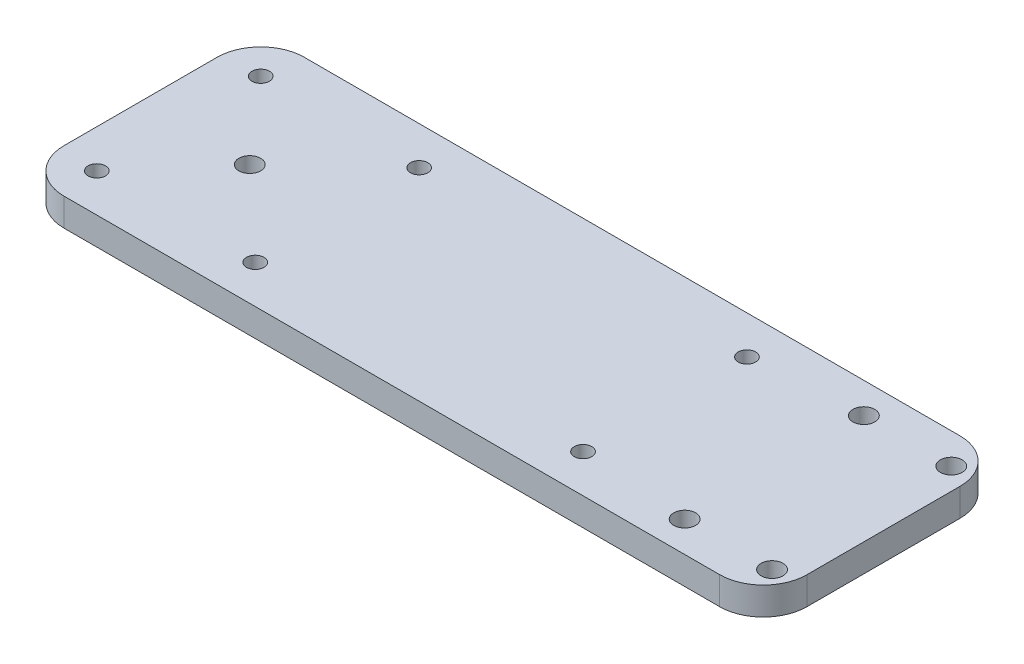
ISO-10303-21;
HEADER;
FILE_DESCRIPTION(('STEP AP214'),'2;1');
FILE_NAME('part.step','',(''),(''),'','','');
FILE_SCHEMA(('AUTOMOTIVE_DESIGN { 1 0 10303 214 1 1 1 1 }'));
ENDSEC;
DATA;
#1=APPLICATION_CONTEXT('core data for automotive mechanical design processes');
#2=APPLICATION_PROTOCOL_DEFINITION('international standard','automotive_design',2000,#1);
#3=PRODUCT_CONTEXT('',#1,'mechanical');
#4=PRODUCT('Part','Part','',(#3));
#5=PRODUCT_RELATED_PRODUCT_CATEGORY('part','',(#4));
#6=PRODUCT_DEFINITION_FORMATION('','',#4);
#7=PRODUCT_DEFINITION_CONTEXT('part definition',#1,'design');
#8=PRODUCT_DEFINITION('design','',#6,#7);
#9=PRODUCT_DEFINITION_SHAPE('','',#8);
#10=(LENGTH_UNIT() NAMED_UNIT(*) SI_UNIT(.MILLI.,.METRE.));
#11=(NAMED_UNIT(*) PLANE_ANGLE_UNIT() SI_UNIT($,.RADIAN.));
#12=(NAMED_UNIT(*) SI_UNIT($,.STERADIAN.) SOLID_ANGLE_UNIT());
#13=UNCERTAINTY_MEASURE_WITH_UNIT(LENGTH_MEASURE(1.E-05),#10,'distance_accuracy_value','');
#14=(GEOMETRIC_REPRESENTATION_CONTEXT(3) GLOBAL_UNCERTAINTY_ASSIGNED_CONTEXT((#13)) GLOBAL_UNIT_ASSIGNED_CONTEXT((#10,
#11,#12)) REPRESENTATION_CONTEXT('',''));
#15=CARTESIAN_POINT('',(0.,0.,0.));
#16=DIRECTION('',(0.,0.,1.));
#17=DIRECTION('',(1.,0.,0.));
#18=AXIS2_PLACEMENT_3D('',#15,#16,#17);
#19=CARTESIAN_POINT('',(-25.,6.35,-27.5));
#20=DIRECTION('',(1.,0.,0.));
#21=DIRECTION('',(0.,0.,-1.));
#22=AXIS2_PLACEMENT_3D('',#19,#20,#21);
#23=PLANE('',#22);
#24=DIRECTION('',(0.,0.,1.));
#25=VECTOR('',#24,1.);
#26=CARTESIAN_POINT('',(-25.,0.,-27.5));
#27=LINE('',#26,#25);
#28=CARTESIAN_POINT('',(-25.,0.,-17.5));
#29=VERTEX_POINT('',#28);
#30=CARTESIAN_POINT('',(-25.,0.,17.5));
#31=VERTEX_POINT('',#30);
#32=EDGE_CURVE('E136',#29,#31,#27,.T.);
#33=ORIENTED_EDGE('',*,*,#32,.T.);
#34=DIRECTION('',(0.,-1.,0.));
#35=VECTOR('',#34,1.);
#36=CARTESIAN_POINT('',(-25.,6.35,17.5));
#37=LINE('',#36,#35);
#38=CARTESIAN_POINT('',(-25.,6.35,17.5));
#39=VERTEX_POINT('',#38);
#40=EDGE_CURVE('E111',#31,#39,#37,.F.);
#41=ORIENTED_EDGE('',*,*,#40,.T.);
#42=DIRECTION('',(0.,0.,1.));
#43=VECTOR('',#42,1.);
#44=CARTESIAN_POINT('',(-25.,6.35,-27.5));
#45=LINE('',#44,#43);
#46=CARTESIAN_POINT('',(-25.,6.35,-17.5));
#47=VERTEX_POINT('',#46);
#48=EDGE_CURVE('E149',#47,#39,#45,.T.);
#49=ORIENTED_EDGE('',*,*,#48,.F.);
#50=DIRECTION('',(0.,-1.,0.));
#51=VECTOR('',#50,1.);
#52=CARTESIAN_POINT('',(-25.,6.35,-17.5));
#53=LINE('',#52,#51);
#54=EDGE_CURVE('E117',#47,#29,#53,.T.);
#55=ORIENTED_EDGE('',*,*,#54,.T.);
#56=EDGE_LOOP('',(#33,#41,#49,#55));
#57=FACE_BOUND('',#56,.T.);
#58=ADVANCED_FACE('F39',(#57),#23,.F.);
#59=CARTESIAN_POINT('',(-25.,6.35,27.5));
#60=DIRECTION('',(0.,0.,-1.));
#61=DIRECTION('',(-1.,0.,0.));
#62=AXIS2_PLACEMENT_3D('',#59,#60,#61);
#63=PLANE('',#62);
#64=DIRECTION('',(1.,0.,0.));
#65=VECTOR('',#64,1.);
#66=CARTESIAN_POINT('',(-25.,6.35,27.5));
#67=LINE('',#66,#65);
#68=CARTESIAN_POINT('',(-15.,6.35,27.5));
#69=VERTEX_POINT('',#68);
#70=CARTESIAN_POINT('',(135.,6.35,27.5));
#71=VERTEX_POINT('',#70);
#72=EDGE_CURVE('E127',#69,#71,#67,.T.);
#73=ORIENTED_EDGE('',*,*,#72,.F.);
#74=DIRECTION('',(0.,-1.,0.));
#75=VECTOR('',#74,1.);
#76=CARTESIAN_POINT('',(-15.,6.35,27.5));
#77=LINE('',#76,#75);
#78=CARTESIAN_POINT('',(-15.,0.,27.5));
#79=VERTEX_POINT('',#78);
#80=EDGE_CURVE('E110',#69,#79,#77,.T.);
#81=ORIENTED_EDGE('',*,*,#80,.T.);
#82=DIRECTION('',(1.,0.,0.));
#83=VECTOR('',#82,1.);
#84=CARTESIAN_POINT('',(-25.,0.,27.5));
#85=LINE('',#84,#83);
#86=CARTESIAN_POINT('',(135.,0.,27.5));
#87=VERTEX_POINT('',#86);
#88=EDGE_CURVE('E124',#79,#87,#85,.T.);
#89=ORIENTED_EDGE('',*,*,#88,.T.);
#90=DIRECTION('',(0.,-1.,0.));
#91=VECTOR('',#90,1.);
#92=CARTESIAN_POINT('',(135.,6.35,27.5));
#93=LINE('',#92,#91);
#94=EDGE_CURVE('E130',#87,#71,#93,.F.);
#95=ORIENTED_EDGE('',*,*,#94,.T.);
#96=EDGE_LOOP('',(#73,#81,#89,#95));
#97=FACE_BOUND('',#96,.T.);
#98=ADVANCED_FACE('F123',(#97),#63,.F.);
#99=CARTESIAN_POINT('',(145.,6.35,-27.5));
#100=DIRECTION('',(-1.,0.,0.));
#101=DIRECTION('',(0.,0.,1.));
#102=AXIS2_PLACEMENT_3D('',#99,#100,#101);
#103=PLANE('',#102);
#104=DIRECTION('',(0.,0.,-1.));
#105=VECTOR('',#104,1.);
#106=CARTESIAN_POINT('',(145.,0.,-27.5));
#107=LINE('',#106,#105);
#108=CARTESIAN_POINT('',(145.,0.,17.5));
#109=VERTEX_POINT('',#108);
#110=CARTESIAN_POINT('',(145.,0.,-17.5));
#111=VERTEX_POINT('',#110);
#112=EDGE_CURVE('E135',#109,#111,#107,.T.);
#113=ORIENTED_EDGE('',*,*,#112,.T.);
#114=DIRECTION('',(0.,-1.,0.));
#115=VECTOR('',#114,1.);
#116=CARTESIAN_POINT('',(145.,6.35,-17.5));
#117=LINE('',#116,#115);
#118=CARTESIAN_POINT('',(145.,6.35,-17.5));
#119=VERTEX_POINT('',#118);
#120=EDGE_CURVE('E11',#111,#119,#117,.F.);
#121=ORIENTED_EDGE('',*,*,#120,.T.);
#122=DIRECTION('',(0.,0.,-1.));
#123=VECTOR('',#122,1.);
#124=CARTESIAN_POINT('',(145.,6.35,-27.5));
#125=LINE('',#124,#123);
#126=CARTESIAN_POINT('',(145.,6.35,17.5));
#127=VERTEX_POINT('',#126);
#128=EDGE_CURVE('E188',#127,#119,#125,.T.);
#129=ORIENTED_EDGE('',*,*,#128,.F.);
#130=DIRECTION('',(0.,-1.,0.));
#131=VECTOR('',#130,1.);
#132=CARTESIAN_POINT('',(145.,6.35,17.5));
#133=LINE('',#132,#131);
#134=EDGE_CURVE('E48',#127,#109,#133,.T.);
#135=ORIENTED_EDGE('',*,*,#134,.T.);
#136=EDGE_LOOP('',(#113,#121,#129,#135));
#137=FACE_BOUND('',#136,.T.);
#138=ADVANCED_FACE('F186',(#137),#103,.F.);
#139=CARTESIAN_POINT('',(-25.,6.35,-27.5));
#140=DIRECTION('',(0.,0.,1.));
#141=DIRECTION('',(1.,0.,0.));
#142=AXIS2_PLACEMENT_3D('',#139,#140,#141);
#143=PLANE('',#142);
#144=DIRECTION('',(-1.,0.,0.));
#145=VECTOR('',#144,1.);
#146=CARTESIAN_POINT('',(-25.,0.,-27.5));
#147=LINE('',#146,#145);
#148=CARTESIAN_POINT('',(135.,0.,-27.5));
#149=VERTEX_POINT('',#148);
#150=CARTESIAN_POINT('',(-15.,0.,-27.5));
#151=VERTEX_POINT('',#150);
#152=EDGE_CURVE('E141',#149,#151,#147,.T.);
#153=ORIENTED_EDGE('',*,*,#152,.T.);
#154=DIRECTION('',(0.,-1.,0.));
#155=VECTOR('',#154,1.);
#156=CARTESIAN_POINT('',(-15.,6.35,-27.5));
#157=LINE('',#156,#155);
#158=CARTESIAN_POINT('',(-15.,6.35,-27.5));
#159=VERTEX_POINT('',#158);
#160=EDGE_CURVE('E55',#151,#159,#157,.F.);
#161=ORIENTED_EDGE('',*,*,#160,.T.);
#162=DIRECTION('',(-1.,0.,0.));
#163=VECTOR('',#162,1.);
#164=CARTESIAN_POINT('',(-25.,6.35,-27.5));
#165=LINE('',#164,#163);
#166=CARTESIAN_POINT('',(135.,6.35,-27.5));
#167=VERTEX_POINT('',#166);
#168=EDGE_CURVE('E151',#167,#159,#165,.T.);
#169=ORIENTED_EDGE('',*,*,#168,.F.);
#170=DIRECTION('',(0.,-1.,0.));
#171=VECTOR('',#170,1.);
#172=CARTESIAN_POINT('',(135.,6.35,-27.5));
#173=LINE('',#172,#171);
#174=EDGE_CURVE('E176',#167,#149,#173,.T.);
#175=ORIENTED_EDGE('',*,*,#174,.T.);
#176=EDGE_LOOP('',(#153,#161,#169,#175));
#177=FACE_BOUND('',#176,.T.);
#178=ADVANCED_FACE('F195',(#177),#143,.F.);
#179=CARTESIAN_POINT('',(0.,6.35,0.));
#180=DIRECTION('',(0.,1.,0.));
#181=DIRECTION('',(0.,0.,1.));
#182=AXIS2_PLACEMENT_3D('',#179,#180,#181);
#183=PLANE('',#182);
#184=CARTESIAN_POINT('',(140.,6.35,-20.5));
#185=DIRECTION('',(0.,1.,0.));
#186=DIRECTION('',(0.,0.,1.));
#187=AXIS2_PLACEMENT_3D('',#184,#185,#186);
#188=CIRCLE('',#187,2.5);
#189=CARTESIAN_POINT('',(140.,6.35,-18.));
#190=VERTEX_POINT('',#189);
#191=EDGE_CURVE('E289',#190,#190,#188,.T.);
#192=ORIENTED_EDGE('',*,*,#191,.F.);
#193=EDGE_LOOP('',(#192));
#194=FACE_BOUND('',#193,.T.);
#195=CARTESIAN_POINT('',(120.,6.35,-20.5));
#196=DIRECTION('',(0.,1.,0.));
#197=DIRECTION('',(0.,0.,1.));
#198=AXIS2_PLACEMENT_3D('',#195,#196,#197);
#199=CIRCLE('',#198,2.49999999999999);
#200=CARTESIAN_POINT('',(120.,6.35,-18.));
#201=VERTEX_POINT('',#200);
#202=EDGE_CURVE('E281',#201,#201,#199,.T.);
#203=ORIENTED_EDGE('',*,*,#202,.F.);
#204=EDGE_LOOP('',(#203));
#205=FACE_BOUND('',#204,.T.);
#206=CARTESIAN_POINT('',(140.,6.35,20.5));
#207=DIRECTION('',(0.,1.,0.));
#208=DIRECTION('',(0.,0.,1.));
#209=AXIS2_PLACEMENT_3D('',#206,#207,#208);
#210=CIRCLE('',#209,2.5);
#211=CARTESIAN_POINT('',(140.,6.35,23.));
#212=VERTEX_POINT('',#211);
#213=EDGE_CURVE('E273',#212,#212,#210,.T.);
#214=ORIENTED_EDGE('',*,*,#213,.F.);
#215=EDGE_LOOP('',(#214));
#216=FACE_BOUND('',#215,.T.);
#217=CARTESIAN_POINT('',(120.,6.35,20.5));
#218=DIRECTION('',(0.,1.,0.));
#219=DIRECTION('',(0.,0.,1.));
#220=AXIS2_PLACEMENT_3D('',#217,#218,#219);
#221=CIRCLE('',#220,2.49999999999999);
#222=CARTESIAN_POINT('',(120.,6.35,23.));
#223=VERTEX_POINT('',#222);
#224=EDGE_CURVE('E265',#223,#223,#221,.T.);
#225=ORIENTED_EDGE('',*,*,#224,.F.);
#226=EDGE_LOOP('',(#225));
#227=FACE_BOUND('',#226,.T.);
#228=CARTESIAN_POINT('',(-16.25,6.35,18.75));
#229=DIRECTION('',(0.,1.,0.));
#230=DIRECTION('',(0.,0.,1.));
#231=AXIS2_PLACEMENT_3D('',#228,#229,#230);
#232=CIRCLE('',#231,2.);
#233=CARTESIAN_POINT('',(-16.25,6.35,20.75));
#234=VERTEX_POINT('',#233);
#235=EDGE_CURVE('E257',#234,#234,#232,.T.);
#236=ORIENTED_EDGE('',*,*,#235,.F.);
#237=EDGE_LOOP('',(#236));
#238=FACE_BOUND('',#237,.T.);
#239=CARTESIAN_POINT('',(20.,6.35,18.75));
#240=DIRECTION('',(0.,1.,0.));
#241=DIRECTION('',(0.,0.,1.));
#242=AXIS2_PLACEMENT_3D('',#239,#240,#241);
#243=CIRCLE('',#242,2.);
#244=CARTESIAN_POINT('',(20.,6.35,20.75));
#245=VERTEX_POINT('',#244);
#246=EDGE_CURVE('E249',#245,#245,#243,.T.);
#247=ORIENTED_EDGE('',*,*,#246,.F.);
#248=EDGE_LOOP('',(#247));
#249=FACE_BOUND('',#248,.T.);
#250=CARTESIAN_POINT('',(95.,6.35,18.75));
#251=DIRECTION('',(0.,1.,0.));
#252=DIRECTION('',(0.,0.,1.));
#253=AXIS2_PLACEMENT_3D('',#250,#251,#252);
#254=CIRCLE('',#253,2.);
#255=CARTESIAN_POINT('',(95.,6.35,20.75));
#256=VERTEX_POINT('',#255);
#257=EDGE_CURVE('E241',#256,#256,#254,.T.);
#258=ORIENTED_EDGE('',*,*,#257,.F.);
#259=EDGE_LOOP('',(#258));
#260=FACE_BOUND('',#259,.T.);
#261=CARTESIAN_POINT('',(95.,6.35,-18.75));
#262=DIRECTION('',(0.,1.,0.));
#263=DIRECTION('',(0.,0.,1.));
#264=AXIS2_PLACEMENT_3D('',#261,#262,#263);
#265=CIRCLE('',#264,2.);
#266=CARTESIAN_POINT('',(95.,6.35,-16.75));
#267=VERTEX_POINT('',#266);
#268=EDGE_CURVE('E233',#267,#267,#265,.T.);
#269=ORIENTED_EDGE('',*,*,#268,.F.);
#270=EDGE_LOOP('',(#269));
#271=FACE_BOUND('',#270,.T.);
#272=CARTESIAN_POINT('',(20.,6.35,-18.75));
#273=DIRECTION('',(0.,1.,0.));
#274=DIRECTION('',(0.,0.,1.));
#275=AXIS2_PLACEMENT_3D('',#272,#273,#274);
#276=CIRCLE('',#275,2.);
#277=CARTESIAN_POINT('',(20.,6.35,-16.75));
#278=VERTEX_POINT('',#277);
#279=EDGE_CURVE('E225',#278,#278,#276,.T.);
#280=ORIENTED_EDGE('',*,*,#279,.F.);
#281=EDGE_LOOP('',(#280));
#282=FACE_BOUND('',#281,.T.);
#283=CARTESIAN_POINT('',(-16.25,6.35,-18.75));
#284=DIRECTION('',(0.,1.,0.));
#285=DIRECTION('',(0.,0.,1.));
#286=AXIS2_PLACEMENT_3D('',#283,#284,#285);
#287=CIRCLE('',#286,2.);
#288=CARTESIAN_POINT('',(-16.25,6.35,-16.75));
#289=VERTEX_POINT('',#288);
#290=EDGE_CURVE('E217',#289,#289,#287,.T.);
#291=ORIENTED_EDGE('',*,*,#290,.F.);
#292=EDGE_LOOP('',(#291));
#293=FACE_BOUND('',#292,.T.);
#294=CARTESIAN_POINT('',(0.,6.35,0.));
#295=DIRECTION('',(0.,1.,0.));
#296=DIRECTION('',(0.,0.,1.));
#297=AXIS2_PLACEMENT_3D('',#294,#295,#296);
#298=CIRCLE('',#297,2.5);
#299=CARTESIAN_POINT('',(0.,6.35,2.5));
#300=VERTEX_POINT('',#299);
#301=EDGE_CURVE('E209',#300,#300,#298,.T.);
#302=ORIENTED_EDGE('',*,*,#301,.F.);
#303=EDGE_LOOP('',(#302));
#304=FACE_BOUND('',#303,.T.);
#305=ORIENTED_EDGE('',*,*,#48,.T.);
#306=CARTESIAN_POINT('',(-15.,6.35,17.5));
#307=DIRECTION('',(0.,1.,0.));
#308=DIRECTION('',(0.,0.,1.));
#309=AXIS2_PLACEMENT_3D('',#306,#307,#308);
#310=CIRCLE('',#309,10.);
#311=EDGE_CURVE('E173',#39,#69,#310,.T.);
#312=ORIENTED_EDGE('',*,*,#311,.T.);
#313=ORIENTED_EDGE('',*,*,#72,.T.);
#314=CARTESIAN_POINT('',(135.,6.35,17.5));
#315=DIRECTION('',(0.,1.,0.));
#316=DIRECTION('',(0.,0.,1.));
#317=AXIS2_PLACEMENT_3D('',#314,#315,#316);
#318=CIRCLE('',#317,10.);
#319=EDGE_CURVE('E165',#71,#127,#318,.T.);
#320=ORIENTED_EDGE('',*,*,#319,.T.);
#321=ORIENTED_EDGE('',*,*,#128,.T.);
#322=CARTESIAN_POINT('',(135.,6.35,-17.5));
#323=DIRECTION('',(0.,1.,0.));
#324=DIRECTION('',(0.,0.,1.));
#325=AXIS2_PLACEMENT_3D('',#322,#323,#324);
#326=CIRCLE('',#325,10.);
#327=EDGE_CURVE('E62',#119,#167,#326,.T.);
#328=ORIENTED_EDGE('',*,*,#327,.T.);
#329=ORIENTED_EDGE('',*,*,#168,.T.);
#330=CARTESIAN_POINT('',(-15.,6.35,-17.5));
#331=DIRECTION('',(0.,1.,0.));
#332=DIRECTION('',(0.,0.,1.));
#333=AXIS2_PLACEMENT_3D('',#330,#331,#332);
#334=CIRCLE('',#333,10.);
#335=EDGE_CURVE('E170',#159,#47,#334,.T.);
#336=ORIENTED_EDGE('',*,*,#335,.T.);
#337=EDGE_LOOP('',(#305,#312,#313,#320,#321,#328,#329,#336));
#338=FACE_BOUND('',#337,.T.);
#339=ADVANCED_FACE('F296',(#194,#205,#216,#227,#238,#249,#260,#271,#282,#293,#304,#338),#183,.T.);
#340=CARTESIAN_POINT('',(0.,0.,0.));
#341=DIRECTION('',(0.,1.,0.));
#342=DIRECTION('',(0.,0.,1.));
#343=AXIS2_PLACEMENT_3D('',#340,#341,#342);
#344=PLANE('',#343);
#345=CARTESIAN_POINT('',(140.,0.,-20.5));
#346=DIRECTION('',(0.,1.,0.));
#347=DIRECTION('',(0.,0.,1.));
#348=AXIS2_PLACEMENT_3D('',#345,#346,#347);
#349=CIRCLE('',#348,2.5);
#350=CARTESIAN_POINT('',(140.,0.,-18.));
#351=VERTEX_POINT('',#350);
#352=EDGE_CURVE('E285',#351,#351,#349,.T.);
#353=ORIENTED_EDGE('',*,*,#352,.T.);
#354=EDGE_LOOP('',(#353));
#355=FACE_BOUND('',#354,.T.);
#356=CARTESIAN_POINT('',(120.,0.,-20.5));
#357=DIRECTION('',(0.,1.,0.));
#358=DIRECTION('',(0.,0.,1.));
#359=AXIS2_PLACEMENT_3D('',#356,#357,#358);
#360=CIRCLE('',#359,2.5);
#361=CARTESIAN_POINT('',(120.,0.,-18.));
#362=VERTEX_POINT('',#361);
#363=EDGE_CURVE('E277',#362,#362,#360,.T.);
#364=ORIENTED_EDGE('',*,*,#363,.T.);
#365=EDGE_LOOP('',(#364));
#366=FACE_BOUND('',#365,.T.);
#367=CARTESIAN_POINT('',(140.,0.,20.5));
#368=DIRECTION('',(0.,1.,0.));
#369=DIRECTION('',(0.,0.,1.));
#370=AXIS2_PLACEMENT_3D('',#367,#368,#369);
#371=CIRCLE('',#370,2.5);
#372=CARTESIAN_POINT('',(140.,0.,23.));
#373=VERTEX_POINT('',#372);
#374=EDGE_CURVE('E269',#373,#373,#371,.T.);
#375=ORIENTED_EDGE('',*,*,#374,.T.);
#376=EDGE_LOOP('',(#375));
#377=FACE_BOUND('',#376,.T.);
#378=CARTESIAN_POINT('',(120.,0.,20.5));
#379=DIRECTION('',(0.,1.,0.));
#380=DIRECTION('',(0.,0.,1.));
#381=AXIS2_PLACEMENT_3D('',#378,#379,#380);
#382=CIRCLE('',#381,2.5);
#383=CARTESIAN_POINT('',(120.,0.,23.));
#384=VERTEX_POINT('',#383);
#385=EDGE_CURVE('E261',#384,#384,#382,.T.);
#386=ORIENTED_EDGE('',*,*,#385,.T.);
#387=EDGE_LOOP('',(#386));
#388=FACE_BOUND('',#387,.T.);
#389=CARTESIAN_POINT('',(-16.25,0.,18.75));
#390=DIRECTION('',(0.,1.,0.));
#391=DIRECTION('',(0.,0.,1.));
#392=AXIS2_PLACEMENT_3D('',#389,#390,#391);
#393=CIRCLE('',#392,2.);
#394=CARTESIAN_POINT('',(-16.25,0.,20.75));
#395=VERTEX_POINT('',#394);
#396=EDGE_CURVE('E253',#395,#395,#393,.T.);
#397=ORIENTED_EDGE('',*,*,#396,.T.);
#398=EDGE_LOOP('',(#397));
#399=FACE_BOUND('',#398,.T.);
#400=CARTESIAN_POINT('',(20.,0.,18.75));
#401=DIRECTION('',(0.,1.,0.));
#402=DIRECTION('',(0.,0.,1.));
#403=AXIS2_PLACEMENT_3D('',#400,#401,#402);
#404=CIRCLE('',#403,2.);
#405=CARTESIAN_POINT('',(20.,0.,20.75));
#406=VERTEX_POINT('',#405);
#407=EDGE_CURVE('E245',#406,#406,#404,.T.);
#408=ORIENTED_EDGE('',*,*,#407,.T.);
#409=EDGE_LOOP('',(#408));
#410=FACE_BOUND('',#409,.T.);
#411=CARTESIAN_POINT('',(95.,0.,18.75));
#412=DIRECTION('',(0.,1.,0.));
#413=DIRECTION('',(0.,0.,1.));
#414=AXIS2_PLACEMENT_3D('',#411,#412,#413);
#415=CIRCLE('',#414,2.);
#416=CARTESIAN_POINT('',(95.,0.,20.75));
#417=VERTEX_POINT('',#416);
#418=EDGE_CURVE('E237',#417,#417,#415,.T.);
#419=ORIENTED_EDGE('',*,*,#418,.T.);
#420=EDGE_LOOP('',(#419));
#421=FACE_BOUND('',#420,.T.);
#422=CARTESIAN_POINT('',(95.,0.,-18.75));
#423=DIRECTION('',(0.,1.,0.));
#424=DIRECTION('',(0.,0.,1.));
#425=AXIS2_PLACEMENT_3D('',#422,#423,#424);
#426=CIRCLE('',#425,2.);
#427=CARTESIAN_POINT('',(95.,0.,-16.75));
#428=VERTEX_POINT('',#427);
#429=EDGE_CURVE('E229',#428,#428,#426,.T.);
#430=ORIENTED_EDGE('',*,*,#429,.T.);
#431=EDGE_LOOP('',(#430));
#432=FACE_BOUND('',#431,.T.);
#433=CARTESIAN_POINT('',(20.,0.,-18.75));
#434=DIRECTION('',(0.,1.,0.));
#435=DIRECTION('',(0.,0.,1.));
#436=AXIS2_PLACEMENT_3D('',#433,#434,#435);
#437=CIRCLE('',#436,2.);
#438=CARTESIAN_POINT('',(20.,0.,-16.75));
#439=VERTEX_POINT('',#438);
#440=EDGE_CURVE('E221',#439,#439,#437,.T.);
#441=ORIENTED_EDGE('',*,*,#440,.T.);
#442=EDGE_LOOP('',(#441));
#443=FACE_BOUND('',#442,.T.);
#444=CARTESIAN_POINT('',(-16.25,0.,-18.75));
#445=DIRECTION('',(0.,1.,0.));
#446=DIRECTION('',(0.,0.,1.));
#447=AXIS2_PLACEMENT_3D('',#444,#445,#446);
#448=CIRCLE('',#447,2.);
#449=CARTESIAN_POINT('',(-16.25,0.,-16.75));
#450=VERTEX_POINT('',#449);
#451=EDGE_CURVE('E213',#450,#450,#448,.T.);
#452=ORIENTED_EDGE('',*,*,#451,.T.);
#453=EDGE_LOOP('',(#452));
#454=FACE_BOUND('',#453,.T.);
#455=CARTESIAN_POINT('',(0.,0.,0.));
#456=DIRECTION('',(0.,1.,0.));
#457=DIRECTION('',(0.,0.,1.));
#458=AXIS2_PLACEMENT_3D('',#455,#456,#457);
#459=CIRCLE('',#458,2.5);
#460=CARTESIAN_POINT('',(0.,0.,2.5));
#461=VERTEX_POINT('',#460);
#462=EDGE_CURVE('E143',#461,#461,#459,.T.);
#463=ORIENTED_EDGE('',*,*,#462,.T.);
#464=EDGE_LOOP('',(#463));
#465=FACE_BOUND('',#464,.T.);
#466=ORIENTED_EDGE('',*,*,#88,.F.);
#467=CARTESIAN_POINT('',(-15.,0.,17.5));
#468=DIRECTION('',(0.,1.,0.));
#469=DIRECTION('',(0.,0.,1.));
#470=AXIS2_PLACEMENT_3D('',#467,#468,#469);
#471=CIRCLE('',#470,10.);
#472=EDGE_CURVE('E106',#79,#31,#471,.F.);
#473=ORIENTED_EDGE('',*,*,#472,.T.);
#474=ORIENTED_EDGE('',*,*,#32,.F.);
#475=CARTESIAN_POINT('',(-15.,0.,-17.5));
#476=DIRECTION('',(0.,1.,0.));
#477=DIRECTION('',(0.,0.,1.));
#478=AXIS2_PLACEMENT_3D('',#475,#476,#477);
#479=CIRCLE('',#478,10.);
#480=EDGE_CURVE('E118',#29,#151,#479,.F.);
#481=ORIENTED_EDGE('',*,*,#480,.T.);
#482=ORIENTED_EDGE('',*,*,#152,.F.);
#483=CARTESIAN_POINT('',(135.,0.,-17.5));
#484=DIRECTION('',(0.,1.,0.));
#485=DIRECTION('',(0.,0.,1.));
#486=AXIS2_PLACEMENT_3D('',#483,#484,#485);
#487=CIRCLE('',#486,10.);
#488=EDGE_CURVE('E155',#149,#111,#487,.F.);
#489=ORIENTED_EDGE('',*,*,#488,.T.);
#490=ORIENTED_EDGE('',*,*,#112,.F.);
#491=CARTESIAN_POINT('',(135.,0.,17.5));
#492=DIRECTION('',(0.,1.,0.));
#493=DIRECTION('',(0.,0.,1.));
#494=AXIS2_PLACEMENT_3D('',#491,#492,#493);
#495=CIRCLE('',#494,10.);
#496=EDGE_CURVE('E129',#109,#87,#495,.F.);
#497=ORIENTED_EDGE('',*,*,#496,.T.);
#498=EDGE_LOOP('',(#466,#473,#474,#481,#482,#489,#490,#497));
#499=FACE_BOUND('',#498,.T.);
#500=ADVANCED_FACE('F132',(#355,#366,#377,#388,#399,#410,#421,#432,#443,#454,#465,#499),#344,.F.);
#501=CARTESIAN_POINT('',(-15.,6.35,17.5));
#502=DIRECTION('',(0.,-1.,0.));
#503=DIRECTION('',(0.,0.,-1.));
#504=AXIS2_PLACEMENT_3D('',#501,#502,#503);
#505=CYLINDRICAL_SURFACE('',#504,10.);
#506=ORIENTED_EDGE('',*,*,#311,.F.);
#507=ORIENTED_EDGE('',*,*,#40,.F.);
#508=ORIENTED_EDGE('',*,*,#472,.F.);
#509=ORIENTED_EDGE('',*,*,#80,.F.);
#510=EDGE_LOOP('',(#506,#507,#508,#509));
#511=FACE_BOUND('',#510,.T.);
#512=ADVANCED_FACE('F109',(#511),#505,.T.);
#513=CARTESIAN_POINT('',(-15.,6.35,-17.5));
#514=DIRECTION('',(0.,-1.,0.));
#515=DIRECTION('',(0.,0.,-1.));
#516=AXIS2_PLACEMENT_3D('',#513,#514,#515);
#517=CYLINDRICAL_SURFACE('',#516,10.);
#518=ORIENTED_EDGE('',*,*,#335,.F.);
#519=ORIENTED_EDGE('',*,*,#160,.F.);
#520=ORIENTED_EDGE('',*,*,#480,.F.);
#521=ORIENTED_EDGE('',*,*,#54,.F.);
#522=EDGE_LOOP('',(#518,#519,#520,#521));
#523=FACE_BOUND('',#522,.T.);
#524=ADVANCED_FACE('F323',(#523),#517,.T.);
#525=CARTESIAN_POINT('',(135.,6.35,-17.5));
#526=DIRECTION('',(0.,-1.,0.));
#527=DIRECTION('',(0.,0.,-1.));
#528=AXIS2_PLACEMENT_3D('',#525,#526,#527);
#529=CYLINDRICAL_SURFACE('',#528,10.);
#530=ORIENTED_EDGE('',*,*,#327,.F.);
#531=ORIENTED_EDGE('',*,*,#120,.F.);
#532=ORIENTED_EDGE('',*,*,#488,.F.);
#533=ORIENTED_EDGE('',*,*,#174,.F.);
#534=EDGE_LOOP('',(#530,#531,#532,#533));
#535=FACE_BOUND('',#534,.T.);
#536=ADVANCED_FACE('F194',(#535),#529,.T.);
#537=CARTESIAN_POINT('',(135.,6.35,17.5));
#538=DIRECTION('',(0.,-1.,0.));
#539=DIRECTION('',(0.,0.,-1.));
#540=AXIS2_PLACEMENT_3D('',#537,#538,#539);
#541=CYLINDRICAL_SURFACE('',#540,10.);
#542=ORIENTED_EDGE('',*,*,#319,.F.);
#543=ORIENTED_EDGE('',*,*,#94,.F.);
#544=ORIENTED_EDGE('',*,*,#496,.F.);
#545=ORIENTED_EDGE('',*,*,#134,.F.);
#546=EDGE_LOOP('',(#542,#543,#544,#545));
#547=FACE_BOUND('',#546,.T.);
#548=ADVANCED_FACE('F41',(#547),#541,.T.);
#549=CARTESIAN_POINT('',(0.,6.35,0.));
#550=DIRECTION('',(0.,1.,0.));
#551=DIRECTION('',(0.,0.,1.));
#552=AXIS2_PLACEMENT_3D('',#549,#550,#551);
#553=CYLINDRICAL_SURFACE('',#552,2.5);
#554=ORIENTED_EDGE('',*,*,#462,.F.);
#555=EDGE_LOOP('',(#554));
#556=FACE_BOUND('',#555,.T.);
#557=ORIENTED_EDGE('',*,*,#301,.T.);
#558=EDGE_LOOP('',(#557));
#559=FACE_BOUND('',#558,.T.);
#560=ADVANCED_FACE('F345',(#556,#559),#553,.F.);
#561=CARTESIAN_POINT('',(-16.25,6.35,-18.75));
#562=DIRECTION('',(0.,1.,0.));
#563=DIRECTION('',(0.,0.,1.));
#564=AXIS2_PLACEMENT_3D('',#561,#562,#563);
#565=CYLINDRICAL_SURFACE('',#564,2.);
#566=ORIENTED_EDGE('',*,*,#451,.F.);
#567=EDGE_LOOP('',(#566));
#568=FACE_BOUND('',#567,.T.);
#569=ORIENTED_EDGE('',*,*,#290,.T.);
#570=EDGE_LOOP('',(#569));
#571=FACE_BOUND('',#570,.T.);
#572=ADVANCED_FACE('F348',(#568,#571),#565,.F.);
#573=CARTESIAN_POINT('',(20.,6.35,-18.75));
#574=DIRECTION('',(0.,1.,0.));
#575=DIRECTION('',(0.,0.,1.));
#576=AXIS2_PLACEMENT_3D('',#573,#574,#575);
#577=CYLINDRICAL_SURFACE('',#576,2.);
#578=ORIENTED_EDGE('',*,*,#440,.F.);
#579=EDGE_LOOP('',(#578));
#580=FACE_BOUND('',#579,.T.);
#581=ORIENTED_EDGE('',*,*,#279,.T.);
#582=EDGE_LOOP('',(#581));
#583=FACE_BOUND('',#582,.T.);
#584=ADVANCED_FACE('F352',(#580,#583),#577,.F.);
#585=CARTESIAN_POINT('',(95.,6.35,-18.75));
#586=DIRECTION('',(0.,1.,0.));
#587=DIRECTION('',(0.,0.,1.));
#588=AXIS2_PLACEMENT_3D('',#585,#586,#587);
#589=CYLINDRICAL_SURFACE('',#588,2.);
#590=ORIENTED_EDGE('',*,*,#429,.F.);
#591=EDGE_LOOP('',(#590));
#592=FACE_BOUND('',#591,.T.);
#593=ORIENTED_EDGE('',*,*,#268,.T.);
#594=EDGE_LOOP('',(#593));
#595=FACE_BOUND('',#594,.T.);
#596=ADVANCED_FACE('F356',(#592,#595),#589,.F.);
#597=CARTESIAN_POINT('',(95.,6.35,18.75));
#598=DIRECTION('',(0.,1.,0.));
#599=DIRECTION('',(0.,0.,1.));
#600=AXIS2_PLACEMENT_3D('',#597,#598,#599);
#601=CYLINDRICAL_SURFACE('',#600,2.);
#602=ORIENTED_EDGE('',*,*,#418,.F.);
#603=EDGE_LOOP('',(#602));
#604=FACE_BOUND('',#603,.T.);
#605=ORIENTED_EDGE('',*,*,#257,.T.);
#606=EDGE_LOOP('',(#605));
#607=FACE_BOUND('',#606,.T.);
#608=ADVANCED_FACE('F360',(#604,#607),#601,.F.);
#609=CARTESIAN_POINT('',(20.,6.35,18.75));
#610=DIRECTION('',(0.,1.,0.));
#611=DIRECTION('',(0.,0.,1.));
#612=AXIS2_PLACEMENT_3D('',#609,#610,#611);
#613=CYLINDRICAL_SURFACE('',#612,2.);
#614=ORIENTED_EDGE('',*,*,#407,.F.);
#615=EDGE_LOOP('',(#614));
#616=FACE_BOUND('',#615,.T.);
#617=ORIENTED_EDGE('',*,*,#246,.T.);
#618=EDGE_LOOP('',(#617));
#619=FACE_BOUND('',#618,.T.);
#620=ADVANCED_FACE('F364',(#616,#619),#613,.F.);
#621=CARTESIAN_POINT('',(-16.25,6.35,18.75));
#622=DIRECTION('',(0.,1.,0.));
#623=DIRECTION('',(0.,0.,1.));
#624=AXIS2_PLACEMENT_3D('',#621,#622,#623);
#625=CYLINDRICAL_SURFACE('',#624,2.);
#626=ORIENTED_EDGE('',*,*,#396,.F.);
#627=EDGE_LOOP('',(#626));
#628=FACE_BOUND('',#627,.T.);
#629=ORIENTED_EDGE('',*,*,#235,.T.);
#630=EDGE_LOOP('',(#629));
#631=FACE_BOUND('',#630,.T.);
#632=ADVANCED_FACE('F368',(#628,#631),#625,.F.);
#633=CARTESIAN_POINT('',(120.,6.35,20.5));
#634=DIRECTION('',(0.,1.,0.));
#635=DIRECTION('',(0.,0.,1.));
#636=AXIS2_PLACEMENT_3D('',#633,#634,#635);
#637=CYLINDRICAL_SURFACE('',#636,2.5);
#638=ORIENTED_EDGE('',*,*,#385,.F.);
#639=EDGE_LOOP('',(#638));
#640=FACE_BOUND('',#639,.T.);
#641=ORIENTED_EDGE('',*,*,#224,.T.);
#642=EDGE_LOOP('',(#641));
#643=FACE_BOUND('',#642,.T.);
#644=ADVANCED_FACE('F372',(#640,#643),#637,.F.);
#645=CARTESIAN_POINT('',(140.,6.35,20.5));
#646=DIRECTION('',(0.,1.,0.));
#647=DIRECTION('',(0.,0.,1.));
#648=AXIS2_PLACEMENT_3D('',#645,#646,#647);
#649=CYLINDRICAL_SURFACE('',#648,2.5);
#650=ORIENTED_EDGE('',*,*,#374,.F.);
#651=EDGE_LOOP('',(#650));
#652=FACE_BOUND('',#651,.T.);
#653=ORIENTED_EDGE('',*,*,#213,.T.);
#654=EDGE_LOOP('',(#653));
#655=FACE_BOUND('',#654,.T.);
#656=ADVANCED_FACE('F376',(#652,#655),#649,.F.);
#657=CARTESIAN_POINT('',(120.,6.35,-20.5));
#658=DIRECTION('',(0.,1.,0.));
#659=DIRECTION('',(0.,0.,1.));
#660=AXIS2_PLACEMENT_3D('',#657,#658,#659);
#661=CYLINDRICAL_SURFACE('',#660,2.5);
#662=ORIENTED_EDGE('',*,*,#363,.F.);
#663=EDGE_LOOP('',(#662));
#664=FACE_BOUND('',#663,.T.);
#665=ORIENTED_EDGE('',*,*,#202,.T.);
#666=EDGE_LOOP('',(#665));
#667=FACE_BOUND('',#666,.T.);
#668=ADVANCED_FACE('F380',(#664,#667),#661,.F.);
#669=CARTESIAN_POINT('',(140.,6.35,-20.5));
#670=DIRECTION('',(0.,1.,0.));
#671=DIRECTION('',(0.,0.,1.));
#672=AXIS2_PLACEMENT_3D('',#669,#670,#671);
#673=CYLINDRICAL_SURFACE('',#672,2.5);
#674=ORIENTED_EDGE('',*,*,#352,.F.);
#675=EDGE_LOOP('',(#674));
#676=FACE_BOUND('',#675,.T.);
#677=ORIENTED_EDGE('',*,*,#191,.T.);
#678=EDGE_LOOP('',(#677));
#679=FACE_BOUND('',#678,.T.);
#680=ADVANCED_FACE('F294',(#676,#679),#673,.F.);
#681=CLOSED_SHELL('',(#58,#98,#138,#178,#339,#500,#512,#524,#536,#548,#560,#572,#584,#596,#608,
#620,#632,#644,#656,#668,#680));
#682=MANIFOLD_SOLID_BREP('B2',#681);
#683=ADVANCED_BREP_SHAPE_REPRESENTATION('',(#18,#682),#14);
#684=SHAPE_DEFINITION_REPRESENTATION(#9,#683);
ENDSEC;
END-ISO-10303-21;
